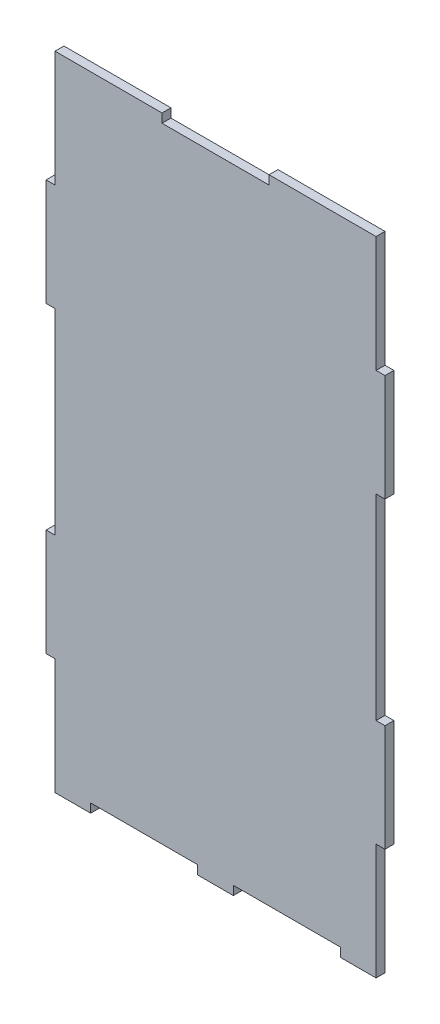
ISO-10303-21;
HEADER;
FILE_DESCRIPTION(('STEP AP214'),'2;1');
FILE_NAME('part.step','',(''),(''),'','','');
FILE_SCHEMA(('AUTOMOTIVE_DESIGN { 1 0 10303 214 1 1 1 1 }'));
ENDSEC;
DATA;
#1=APPLICATION_CONTEXT('core data for automotive mechanical design processes');
#2=APPLICATION_PROTOCOL_DEFINITION('international standard','automotive_design',2000,#1);
#3=PRODUCT_CONTEXT('',#1,'mechanical');
#4=PRODUCT('Part','Part','',(#3));
#5=PRODUCT_RELATED_PRODUCT_CATEGORY('part','',(#4));
#6=PRODUCT_DEFINITION_FORMATION('','',#4);
#7=PRODUCT_DEFINITION_CONTEXT('part definition',#1,'design');
#8=PRODUCT_DEFINITION('design','',#6,#7);
#9=PRODUCT_DEFINITION_SHAPE('','',#8);
#10=(LENGTH_UNIT() NAMED_UNIT(*) SI_UNIT(.MILLI.,.METRE.));
#11=(NAMED_UNIT(*) PLANE_ANGLE_UNIT() SI_UNIT($,.RADIAN.));
#12=(NAMED_UNIT(*) SI_UNIT($,.STERADIAN.) SOLID_ANGLE_UNIT());
#13=UNCERTAINTY_MEASURE_WITH_UNIT(LENGTH_MEASURE(1.E-05),#10,'distance_accuracy_value','');
#14=(GEOMETRIC_REPRESENTATION_CONTEXT(3) GLOBAL_UNCERTAINTY_ASSIGNED_CONTEXT((#13)) GLOBAL_UNIT_ASSIGNED_CONTEXT((#10,
#11,#12)) REPRESENTATION_CONTEXT('',''));
#15=CARTESIAN_POINT('',(0.,0.,0.));
#16=DIRECTION('',(0.,0.,1.));
#17=DIRECTION('',(1.,0.,0.));
#18=AXIS2_PLACEMENT_3D('',#15,#16,#17);
#19=CARTESIAN_POINT('',(-192.607659574468,-277.23829787234,6.35));
#20=DIRECTION('',(0.,1.,0.));
#21=DIRECTION('',(0.,0.,1.));
#22=AXIS2_PLACEMENT_3D('',#19,#20,#21);
#23=PLANE('',#22);
#24=DIRECTION('',(1.,0.,0.));
#25=VECTOR('',#24,1.);
#26=CARTESIAN_POINT('',(-192.607659574468,-277.23829787234,0.));
#27=LINE('',#26,#25);
#28=CARTESIAN_POINT('',(-91.0076595744681,-277.23829787234,0.));
#29=VERTEX_POINT('',#28);
#30=CARTESIAN_POINT('',(-65.6076595744681,-277.23829787234,0.));
#31=VERTEX_POINT('',#30);
#32=EDGE_CURVE('E268',#29,#31,#27,.T.);
#33=ORIENTED_EDGE('',*,*,#32,.T.);
#34=DIRECTION('',(0.,0.,1.));
#35=VECTOR('',#34,1.);
#36=CARTESIAN_POINT('',(-65.6076595744681,-277.23829787234,0.));
#37=LINE('',#36,#35);
#38=CARTESIAN_POINT('',(-65.6076595744681,-277.23829787234,6.35));
#39=VERTEX_POINT('',#38);
#40=EDGE_CURVE('E373',#31,#39,#37,.T.);
#41=ORIENTED_EDGE('',*,*,#40,.T.);
#42=DIRECTION('',(1.,0.,0.));
#43=VECTOR('',#42,1.);
#44=CARTESIAN_POINT('',(-192.607659574468,-277.23829787234,6.35));
#45=LINE('',#44,#43);
#46=CARTESIAN_POINT('',(-91.0076595744681,-277.23829787234,6.35));
#47=VERTEX_POINT('',#46);
#48=EDGE_CURVE('E323',#47,#39,#45,.T.);
#49=ORIENTED_EDGE('',*,*,#48,.F.);
#50=DIRECTION('',(0.,0.,1.));
#51=VECTOR('',#50,1.);
#52=CARTESIAN_POINT('',(-91.0076595744681,-277.23829787234,0.));
#53=LINE('',#52,#51);
#54=EDGE_CURVE('E381',#29,#47,#53,.T.);
#55=ORIENTED_EDGE('',*,*,#54,.F.);
#56=EDGE_LOOP('',(#33,#41,#49,#55));
#57=FACE_BOUND('',#56,.T.);
#58=ADVANCED_FACE('F35',(#57),#23,.F.);
#59=CARTESIAN_POINT('',(-192.607659574468,179.96170212766,6.35));
#60=DIRECTION('',(0.,-1.,0.));
#61=DIRECTION('',(0.,0.,-1.));
#62=AXIS2_PLACEMENT_3D('',#59,#60,#61);
#63=PLANE('',#62);
#64=DIRECTION('',(-1.,0.,0.));
#65=VECTOR('',#64,1.);
#66=CARTESIAN_POINT('',(-192.607659574468,179.96170212766,6.35));
#67=LINE('',#66,#65);
#68=CARTESIAN_POINT('',(-116.407659574468,179.96170212766,6.35));
#69=VERTEX_POINT('',#68);
#70=CARTESIAN_POINT('',(-192.607659574468,179.96170212766,6.35));
#71=VERTEX_POINT('',#70);
#72=EDGE_CURVE('E312',#69,#71,#67,.T.);
#73=ORIENTED_EDGE('',*,*,#72,.F.);
#74=DIRECTION('',(0.,0.,1.));
#75=VECTOR('',#74,1.);
#76=CARTESIAN_POINT('',(-116.407659574468,179.96170212766,0.));
#77=LINE('',#76,#75);
#78=CARTESIAN_POINT('',(-116.407659574468,179.96170212766,0.));
#79=VERTEX_POINT('',#78);
#80=EDGE_CURVE('E789',#79,#69,#77,.T.);
#81=ORIENTED_EDGE('',*,*,#80,.F.);
#82=DIRECTION('',(-1.,0.,0.));
#83=VECTOR('',#82,1.);
#84=CARTESIAN_POINT('',(-192.607659574468,179.96170212766,0.));
#85=LINE('',#84,#83);
#86=CARTESIAN_POINT('',(-192.607659574468,179.96170212766,0.));
#87=VERTEX_POINT('',#86);
#88=EDGE_CURVE('E289',#79,#87,#85,.T.);
#89=ORIENTED_EDGE('',*,*,#88,.T.);
#90=DIRECTION('',(0.,0.,-1.));
#91=VECTOR('',#90,1.);
#92=CARTESIAN_POINT('',(-192.607659574468,179.96170212766,6.35));
#93=LINE('',#92,#91);
#94=EDGE_CURVE('E301',#71,#87,#93,.T.);
#95=ORIENTED_EDGE('',*,*,#94,.F.);
#96=EDGE_LOOP('',(#73,#81,#89,#95));
#97=FACE_BOUND('',#96,.T.);
#98=ADVANCED_FACE('F518',(#97),#63,.F.);
#99=CARTESIAN_POINT('',(-192.607659574468,-277.23829787234,0.));
#100=VERTEX_POINT('',#99);
#101=CARTESIAN_POINT('',(-167.207659574468,-277.23829787234,0.));
#102=VERTEX_POINT('',#101);
#103=EDGE_CURVE('E271',#100,#102,#27,.T.);
#104=ORIENTED_EDGE('',*,*,#103,.T.);
#105=DIRECTION('',(0.,0.,1.));
#106=VECTOR('',#105,1.);
#107=CARTESIAN_POINT('',(-167.207659574468,-277.23829787234,0.));
#108=LINE('',#107,#106);
#109=CARTESIAN_POINT('',(-167.207659574468,-277.23829787234,6.35));
#110=VERTEX_POINT('',#109);
#111=EDGE_CURVE('E346',#102,#110,#108,.T.);
#112=ORIENTED_EDGE('',*,*,#111,.T.);
#113=CARTESIAN_POINT('',(-192.607659574468,-277.23829787234,6.35));
#114=VERTEX_POINT('',#113);
#115=EDGE_CURVE('E319',#114,#110,#45,.T.);
#116=ORIENTED_EDGE('',*,*,#115,.F.);
#117=DIRECTION('',(0.,0.,-1.));
#118=VECTOR('',#117,1.);
#119=CARTESIAN_POINT('',(-192.607659574468,-277.23829787234,6.35));
#120=LINE('',#119,#118);
#121=EDGE_CURVE('E11',#114,#100,#120,.T.);
#122=ORIENTED_EDGE('',*,*,#121,.T.);
#123=EDGE_LOOP('',(#104,#112,#116,#122));
#124=FACE_BOUND('',#123,.T.);
#125=ADVANCED_FACE('F345',(#124),#23,.F.);
#126=CARTESIAN_POINT('',(35.9923404255318,179.96170212766,6.35));
#127=DIRECTION('',(-1.,0.,0.));
#128=DIRECTION('',(0.,-1.,0.));
#129=AXIS2_PLACEMENT_3D('',#126,#127,#128);
#130=PLANE('',#129);
#131=DIRECTION('',(0.,1.,0.));
#132=VECTOR('',#131,1.);
#133=CARTESIAN_POINT('',(35.9923404255318,179.96170212766,0.));
#134=LINE('',#133,#132);
#135=CARTESIAN_POINT('',(35.9923404255319,-118.48829787234,0.));
#136=VERTEX_POINT('',#135);
#137=CARTESIAN_POINT('',(35.9923404255319,21.2117021276596,0.));
#138=VERTEX_POINT('',#137);
#139=EDGE_CURVE('E283',#136,#138,#134,.T.);
#140=ORIENTED_EDGE('',*,*,#139,.T.);
#141=DIRECTION('',(0.,0.,1.));
#142=VECTOR('',#141,1.);
#143=CARTESIAN_POINT('',(35.9923404255319,21.2117021276596,0.));
#144=LINE('',#143,#142);
#145=CARTESIAN_POINT('',(35.9923404255319,21.2117021276596,6.35));
#146=VERTEX_POINT('',#145);
#147=EDGE_CURVE('E404',#138,#146,#144,.T.);
#148=ORIENTED_EDGE('',*,*,#147,.T.);
#149=DIRECTION('',(0.,1.,0.));
#150=VECTOR('',#149,1.);
#151=CARTESIAN_POINT('',(35.9923404255318,179.96170212766,6.35));
#152=LINE('',#151,#150);
#153=CARTESIAN_POINT('',(35.9923404255319,-118.48829787234,6.35));
#154=VERTEX_POINT('',#153);
#155=EDGE_CURVE('E313',#154,#146,#152,.T.);
#156=ORIENTED_EDGE('',*,*,#155,.F.);
#157=DIRECTION('',(0.,0.,1.));
#158=VECTOR('',#157,1.);
#159=CARTESIAN_POINT('',(35.9923404255319,-118.48829787234,0.));
#160=LINE('',#159,#158);
#161=EDGE_CURVE('E430',#136,#154,#160,.T.);
#162=ORIENTED_EDGE('',*,*,#161,.F.);
#163=EDGE_LOOP('',(#140,#148,#156,#162));
#164=FACE_BOUND('',#163,.T.);
#165=ADVANCED_FACE('F527',(#164),#130,.F.);
#166=CARTESIAN_POINT('',(35.9923404255319,97.4117021276596,6.35));
#167=VERTEX_POINT('',#166);
#168=CARTESIAN_POINT('',(35.9923404255318,179.96170212766,6.35));
#169=VERTEX_POINT('',#168);
#170=EDGE_CURVE('E315',#167,#169,#152,.T.);
#171=ORIENTED_EDGE('',*,*,#170,.F.);
#172=DIRECTION('',(0.,0.,1.));
#173=VECTOR('',#172,1.);
#174=CARTESIAN_POINT('',(35.9923404255319,97.4117021276596,0.));
#175=LINE('',#174,#173);
#176=CARTESIAN_POINT('',(35.9923404255319,97.4117021276596,0.));
#177=VERTEX_POINT('',#176);
#178=EDGE_CURVE('E406',#177,#167,#175,.T.);
#179=ORIENTED_EDGE('',*,*,#178,.F.);
#180=CARTESIAN_POINT('',(35.9923404255318,179.96170212766,0.));
#181=VERTEX_POINT('',#180);
#182=EDGE_CURVE('E279',#177,#181,#134,.T.);
#183=ORIENTED_EDGE('',*,*,#182,.T.);
#184=DIRECTION('',(0.,0.,-1.));
#185=VECTOR('',#184,1.);
#186=CARTESIAN_POINT('',(35.9923404255318,179.96170212766,6.35));
#187=LINE('',#186,#185);
#188=EDGE_CURVE('E303',#169,#181,#187,.T.);
#189=ORIENTED_EDGE('',*,*,#188,.F.);
#190=EDGE_LOOP('',(#171,#179,#183,#189));
#191=FACE_BOUND('',#190,.T.);
#192=ADVANCED_FACE('F533',(#191),#130,.F.);
#193=CARTESIAN_POINT('',(-192.607659574468,179.96170212766,6.35));
#194=DIRECTION('',(1.,0.,0.));
#195=DIRECTION('',(0.,1.,0.));
#196=AXIS2_PLACEMENT_3D('',#193,#194,#195);
#197=PLANE('',#196);
#198=DIRECTION('',(0.,-1.,0.));
#199=VECTOR('',#198,1.);
#200=CARTESIAN_POINT('',(-192.607659574468,179.96170212766,0.));
#201=LINE('',#200,#199);
#202=CARTESIAN_POINT('',(-192.607659574468,21.2117021276595,0.));
#203=VERTEX_POINT('',#202);
#204=CARTESIAN_POINT('',(-192.607659574468,-118.48829787234,0.));
#205=VERTEX_POINT('',#204);
#206=EDGE_CURVE('E274',#203,#205,#201,.T.);
#207=ORIENTED_EDGE('',*,*,#206,.T.);
#208=DIRECTION('',(0.,0.,1.));
#209=VECTOR('',#208,1.);
#210=CARTESIAN_POINT('',(-192.607659574468,-118.48829787234,0.));
#211=LINE('',#210,#209);
#212=CARTESIAN_POINT('',(-192.607659574468,-118.48829787234,6.35));
#213=VERTEX_POINT('',#212);
#214=EDGE_CURVE('E450',#205,#213,#211,.T.);
#215=ORIENTED_EDGE('',*,*,#214,.T.);
#216=DIRECTION('',(0.,-1.,0.));
#217=VECTOR('',#216,1.);
#218=CARTESIAN_POINT('',(-192.607659574468,179.96170212766,6.35));
#219=LINE('',#218,#217);
#220=CARTESIAN_POINT('',(-192.607659574468,21.2117021276595,6.35));
#221=VERTEX_POINT('',#220);
#222=EDGE_CURVE('E330',#221,#213,#219,.T.);
#223=ORIENTED_EDGE('',*,*,#222,.F.);
#224=DIRECTION('',(0.,0.,1.));
#225=VECTOR('',#224,1.);
#226=CARTESIAN_POINT('',(-192.607659574468,21.2117021276595,0.));
#227=LINE('',#226,#225);
#228=EDGE_CURVE('E474',#203,#221,#227,.T.);
#229=ORIENTED_EDGE('',*,*,#228,.F.);
#230=EDGE_LOOP('',(#207,#215,#223,#229));
#231=FACE_BOUND('',#230,.T.);
#232=ADVANCED_FACE('F494',(#231),#197,.F.);
#233=CARTESIAN_POINT('',(-192.607659574468,-194.68829787234,6.35));
#234=VERTEX_POINT('',#233);
#235=EDGE_CURVE('E299',#234,#114,#219,.T.);
#236=ORIENTED_EDGE('',*,*,#235,.F.);
#237=DIRECTION('',(0.,0.,1.));
#238=VECTOR('',#237,1.);
#239=CARTESIAN_POINT('',(-192.607659574468,-194.68829787234,0.));
#240=LINE('',#239,#238);
#241=CARTESIAN_POINT('',(-192.607659574468,-194.68829787234,0.));
#242=VERTEX_POINT('',#241);
#243=EDGE_CURVE('E348',#242,#234,#240,.T.);
#244=ORIENTED_EDGE('',*,*,#243,.F.);
#245=EDGE_CURVE('E276',#242,#100,#201,.T.);
#246=ORIENTED_EDGE('',*,*,#245,.T.);
#247=ORIENTED_EDGE('',*,*,#121,.F.);
#248=EDGE_LOOP('',(#236,#244,#246,#247));
#249=FACE_BOUND('',#248,.T.);
#250=ADVANCED_FACE('F347',(#249),#197,.F.);
#251=CARTESIAN_POINT('',(-192.607659574468,97.4117021276596,0.));
#252=VERTEX_POINT('',#251);
#253=EDGE_CURVE('E269',#87,#252,#201,.T.);
#254=ORIENTED_EDGE('',*,*,#253,.T.);
#255=DIRECTION('',(0.,0.,1.));
#256=VECTOR('',#255,1.);
#257=CARTESIAN_POINT('',(-192.607659574468,97.4117021276596,0.));
#258=LINE('',#257,#256);
#259=CARTESIAN_POINT('',(-192.607659574468,97.4117021276596,6.35));
#260=VERTEX_POINT('',#259);
#261=EDGE_CURVE('E471',#252,#260,#258,.T.);
#262=ORIENTED_EDGE('',*,*,#261,.T.);
#263=EDGE_CURVE('E328',#71,#260,#219,.T.);
#264=ORIENTED_EDGE('',*,*,#263,.F.);
#265=ORIENTED_EDGE('',*,*,#94,.T.);
#266=EDGE_LOOP('',(#254,#262,#264,#265));
#267=FACE_BOUND('',#266,.T.);
#268=ADVANCED_FACE('F37',(#267),#197,.F.);
#269=CARTESIAN_POINT('',(10.5923404255319,-277.23829787234,6.35));
#270=VERTEX_POINT('',#269);
#271=CARTESIAN_POINT('',(35.9923404255319,-277.23829787234,6.35));
#272=VERTEX_POINT('',#271);
#273=EDGE_CURVE('E260',#270,#272,#45,.T.);
#274=ORIENTED_EDGE('',*,*,#273,.F.);
#275=DIRECTION('',(0.,0.,1.));
#276=VECTOR('',#275,1.);
#277=CARTESIAN_POINT('',(10.5923404255319,-277.23829787234,0.));
#278=LINE('',#277,#276);
#279=CARTESIAN_POINT('',(10.5923404255319,-277.23829787234,0.));
#280=VERTEX_POINT('',#279);
#281=EDGE_CURVE('E247',#280,#270,#278,.T.);
#282=ORIENTED_EDGE('',*,*,#281,.F.);
#283=CARTESIAN_POINT('',(35.9923404255319,-277.23829787234,0.));
#284=VERTEX_POINT('',#283);
#285=EDGE_CURVE('E258',#280,#284,#27,.T.);
#286=ORIENTED_EDGE('',*,*,#285,.T.);
#287=DIRECTION('',(0.,0.,-1.));
#288=VECTOR('',#287,1.);
#289=CARTESIAN_POINT('',(35.9923404255319,-277.23829787234,6.35));
#290=LINE('',#289,#288);
#291=EDGE_CURVE('E43',#272,#284,#290,.T.);
#292=ORIENTED_EDGE('',*,*,#291,.F.);
#293=EDGE_LOOP('',(#274,#282,#286,#292));
#294=FACE_BOUND('',#293,.T.);
#295=ADVANCED_FACE('F256',(#294),#23,.F.);
#296=CARTESIAN_POINT('',(35.9923404255319,-194.68829787234,0.));
#297=VERTEX_POINT('',#296);
#298=EDGE_CURVE('E267',#284,#297,#134,.T.);
#299=ORIENTED_EDGE('',*,*,#298,.T.);
#300=DIRECTION('',(0.,0.,1.));
#301=VECTOR('',#300,1.);
#302=CARTESIAN_POINT('',(35.9923404255319,-194.68829787234,0.));
#303=LINE('',#302,#301);
#304=CARTESIAN_POINT('',(35.9923404255319,-194.68829787234,6.35));
#305=VERTEX_POINT('',#304);
#306=EDGE_CURVE('E309',#297,#305,#303,.T.);
#307=ORIENTED_EDGE('',*,*,#306,.T.);
#308=EDGE_CURVE('E308',#272,#305,#152,.T.);
#309=ORIENTED_EDGE('',*,*,#308,.F.);
#310=ORIENTED_EDGE('',*,*,#291,.T.);
#311=EDGE_LOOP('',(#299,#307,#309,#310));
#312=FACE_BOUND('',#311,.T.);
#313=ADVANCED_FACE('F306',(#312),#130,.F.);
#314=CARTESIAN_POINT('',(-40.2076595744681,179.96170212766,0.));
#315=VERTEX_POINT('',#314);
#316=EDGE_CURVE('E292',#181,#315,#85,.T.);
#317=ORIENTED_EDGE('',*,*,#316,.T.);
#318=DIRECTION('',(0.,0.,1.));
#319=VECTOR('',#318,1.);
#320=CARTESIAN_POINT('',(-40.2076595744681,179.96170212766,0.));
#321=LINE('',#320,#319);
#322=CARTESIAN_POINT('',(-40.2076595744681,179.96170212766,6.35));
#323=VERTEX_POINT('',#322);
#324=EDGE_CURVE('E791',#315,#323,#321,.T.);
#325=ORIENTED_EDGE('',*,*,#324,.T.);
#326=EDGE_CURVE('E304',#169,#323,#67,.T.);
#327=ORIENTED_EDGE('',*,*,#326,.F.);
#328=ORIENTED_EDGE('',*,*,#188,.T.);
#329=EDGE_LOOP('',(#317,#325,#327,#328));
#330=FACE_BOUND('',#329,.T.);
#331=ADVANCED_FACE('F524',(#330),#63,.F.);
#332=CARTESIAN_POINT('',(0.,0.,6.35));
#333=DIRECTION('',(0.,0.,1.));
#334=DIRECTION('',(1.,0.,0.));
#335=AXIS2_PLACEMENT_3D('',#332,#333,#334);
#336=PLANE('',#335);
#337=DIRECTION('',(0.,-1.,0.));
#338=VECTOR('',#337,1.);
#339=CARTESIAN_POINT('',(-65.6076595744681,-277.23829787234,6.35));
#340=LINE('',#339,#338);
#341=CARTESIAN_POINT('',(-65.6076595744681,-270.88829787234,6.35));
#342=VERTEX_POINT('',#341);
#343=EDGE_CURVE('E252',#342,#39,#340,.T.);
#344=ORIENTED_EDGE('',*,*,#343,.F.);
#345=DIRECTION('',(-1.,0.,0.));
#346=VECTOR('',#345,1.);
#347=CARTESIAN_POINT('',(10.5923404255319,-270.88829787234,6.35));
#348=LINE('',#347,#346);
#349=CARTESIAN_POINT('',(10.5923404255319,-270.88829787234,6.35));
#350=VERTEX_POINT('',#349);
#351=EDGE_CURVE('E761',#350,#342,#348,.T.);
#352=ORIENTED_EDGE('',*,*,#351,.F.);
#353=DIRECTION('',(0.,1.,0.));
#354=VECTOR('',#353,1.);
#355=CARTESIAN_POINT('',(10.5923404255319,-277.23829787234,6.35));
#356=LINE('',#355,#354);
#357=EDGE_CURVE('E764',#270,#350,#356,.T.);
#358=ORIENTED_EDGE('',*,*,#357,.F.);
#359=ORIENTED_EDGE('',*,*,#273,.T.);
#360=ORIENTED_EDGE('',*,*,#308,.T.);
#361=DIRECTION('',(1.,0.,0.));
#362=VECTOR('',#361,1.);
#363=CARTESIAN_POINT('',(42.3423404255319,-194.68829787234,6.35));
#364=LINE('',#363,#362);
#365=CARTESIAN_POINT('',(42.3423404255319,-194.68829787234,6.35));
#366=VERTEX_POINT('',#365);
#367=EDGE_CURVE('E414',#305,#366,#364,.T.);
#368=ORIENTED_EDGE('',*,*,#367,.T.);
#369=DIRECTION('',(0.,1.,0.));
#370=VECTOR('',#369,1.);
#371=CARTESIAN_POINT('',(42.3423404255319,-118.48829787234,6.35));
#372=LINE('',#371,#370);
#373=CARTESIAN_POINT('',(42.3423404255319,-118.48829787234,6.35));
#374=VERTEX_POINT('',#373);
#375=EDGE_CURVE('E403',#366,#374,#372,.T.);
#376=ORIENTED_EDGE('',*,*,#375,.T.);
#377=DIRECTION('',(-1.,0.,0.));
#378=VECTOR('',#377,1.);
#379=CARTESIAN_POINT('',(42.3423404255319,-118.48829787234,6.35));
#380=LINE('',#379,#378);
#381=EDGE_CURVE('E422',#374,#154,#380,.T.);
#382=ORIENTED_EDGE('',*,*,#381,.T.);
#383=ORIENTED_EDGE('',*,*,#155,.T.);
#384=DIRECTION('',(1.,0.,0.));
#385=VECTOR('',#384,1.);
#386=CARTESIAN_POINT('',(42.3423404255319,21.2117021276596,6.35));
#387=LINE('',#386,#385);
#388=CARTESIAN_POINT('',(42.3423404255319,21.2117021276596,6.35));
#389=VERTEX_POINT('',#388);
#390=EDGE_CURVE('E388',#146,#389,#387,.T.);
#391=ORIENTED_EDGE('',*,*,#390,.T.);
#392=DIRECTION('',(0.,1.,0.));
#393=VECTOR('',#392,1.);
#394=CARTESIAN_POINT('',(42.3423404255319,97.4117021276596,6.35));
#395=LINE('',#394,#393);
#396=CARTESIAN_POINT('',(42.3423404255319,97.4117021276596,6.35));
#397=VERTEX_POINT('',#396);
#398=EDGE_CURVE('E378',#389,#397,#395,.T.);
#399=ORIENTED_EDGE('',*,*,#398,.T.);
#400=DIRECTION('',(-1.,0.,0.));
#401=VECTOR('',#400,1.);
#402=CARTESIAN_POINT('',(42.3423404255319,97.4117021276596,6.35));
#403=LINE('',#402,#401);
#404=EDGE_CURVE('E397',#397,#167,#403,.T.);
#405=ORIENTED_EDGE('',*,*,#404,.T.);
#406=ORIENTED_EDGE('',*,*,#170,.T.);
#407=ORIENTED_EDGE('',*,*,#326,.T.);
#408=DIRECTION('',(0.,1.,0.));
#409=VECTOR('',#408,1.);
#410=CARTESIAN_POINT('',(-40.2076595744681,179.96170212766,6.35));
#411=LINE('',#410,#409);
#412=CARTESIAN_POINT('',(-40.2076595744681,173.61170212766,6.35));
#413=VERTEX_POINT('',#412);
#414=EDGE_CURVE('E778',#413,#323,#411,.T.);
#415=ORIENTED_EDGE('',*,*,#414,.F.);
#416=DIRECTION('',(1.,0.,0.));
#417=VECTOR('',#416,1.);
#418=CARTESIAN_POINT('',(-116.407659574468,173.61170212766,6.35));
#419=LINE('',#418,#417);
#420=CARTESIAN_POINT('',(-116.407659574468,173.61170212766,6.35));
#421=VERTEX_POINT('',#420);
#422=EDGE_CURVE('E785',#421,#413,#419,.T.);
#423=ORIENTED_EDGE('',*,*,#422,.F.);
#424=DIRECTION('',(0.,-1.,0.));
#425=VECTOR('',#424,1.);
#426=CARTESIAN_POINT('',(-116.407659574468,179.96170212766,6.35));
#427=LINE('',#426,#425);
#428=EDGE_CURVE('E782',#69,#421,#427,.T.);
#429=ORIENTED_EDGE('',*,*,#428,.F.);
#430=ORIENTED_EDGE('',*,*,#72,.T.);
#431=ORIENTED_EDGE('',*,*,#263,.T.);
#432=DIRECTION('',(-1.,0.,0.));
#433=VECTOR('',#432,1.);
#434=CARTESIAN_POINT('',(-198.957659574468,97.4117021276596,6.35));
#435=LINE('',#434,#433);
#436=CARTESIAN_POINT('',(-198.957659574468,97.4117021276596,6.35));
#437=VERTEX_POINT('',#436);
#438=EDGE_CURVE('E458',#260,#437,#435,.T.);
#439=ORIENTED_EDGE('',*,*,#438,.T.);
#440=DIRECTION('',(0.,-1.,0.));
#441=VECTOR('',#440,1.);
#442=CARTESIAN_POINT('',(-198.957659574468,97.4117021276596,6.35));
#443=LINE('',#442,#441);
#444=CARTESIAN_POINT('',(-198.957659574468,21.2117021276595,6.35));
#445=VERTEX_POINT('',#444);
#446=EDGE_CURVE('E449',#437,#445,#443,.T.);
#447=ORIENTED_EDGE('',*,*,#446,.T.);
#448=DIRECTION('',(1.,0.,0.));
#449=VECTOR('',#448,1.);
#450=CARTESIAN_POINT('',(-198.957659574468,21.2117021276595,6.35));
#451=LINE('',#450,#449);
#452=EDGE_CURVE('E466',#445,#221,#451,.T.);
#453=ORIENTED_EDGE('',*,*,#452,.T.);
#454=ORIENTED_EDGE('',*,*,#222,.T.);
#455=DIRECTION('',(-1.,0.,0.));
#456=VECTOR('',#455,1.);
#457=CARTESIAN_POINT('',(-198.957659574468,-118.48829787234,6.35));
#458=LINE('',#457,#456);
#459=CARTESIAN_POINT('',(-198.957659574468,-118.48829787234,6.35));
#460=VERTEX_POINT('',#459);
#461=EDGE_CURVE('E437',#213,#460,#458,.T.);
#462=ORIENTED_EDGE('',*,*,#461,.T.);
#463=DIRECTION('',(0.,-1.,0.));
#464=VECTOR('',#463,1.);
#465=CARTESIAN_POINT('',(-198.957659574468,-118.48829787234,6.35));
#466=LINE('',#465,#464);
#467=CARTESIAN_POINT('',(-198.957659574468,-194.68829787234,6.35));
#468=VERTEX_POINT('',#467);
#469=EDGE_CURVE('E428',#460,#468,#466,.T.);
#470=ORIENTED_EDGE('',*,*,#469,.T.);
#471=DIRECTION('',(1.,0.,0.));
#472=VECTOR('',#471,1.);
#473=CARTESIAN_POINT('',(-198.957659574468,-194.68829787234,6.35));
#474=LINE('',#473,#472);
#475=EDGE_CURVE('E340',#468,#234,#474,.T.);
#476=ORIENTED_EDGE('',*,*,#475,.T.);
#477=ORIENTED_EDGE('',*,*,#235,.T.);
#478=ORIENTED_EDGE('',*,*,#115,.T.);
#479=DIRECTION('',(0.,-1.,0.));
#480=VECTOR('',#479,1.);
#481=CARTESIAN_POINT('',(-167.207659574468,-277.23829787234,6.35));
#482=LINE('',#481,#480);
#483=CARTESIAN_POINT('',(-167.207659574468,-270.88829787234,6.35));
#484=VERTEX_POINT('',#483);
#485=EDGE_CURVE('E371',#484,#110,#482,.T.);
#486=ORIENTED_EDGE('',*,*,#485,.F.);
#487=DIRECTION('',(-1.,0.,0.));
#488=VECTOR('',#487,1.);
#489=CARTESIAN_POINT('',(-167.207659574468,-270.88829787234,6.35));
#490=LINE('',#489,#488);
#491=CARTESIAN_POINT('',(-91.0076595744681,-270.88829787234,6.35));
#492=VERTEX_POINT('',#491);
#493=EDGE_CURVE('E360',#492,#484,#490,.T.);
#494=ORIENTED_EDGE('',*,*,#493,.F.);
#495=DIRECTION('',(0.,1.,0.));
#496=VECTOR('',#495,1.);
#497=CARTESIAN_POINT('',(-91.0076595744681,-277.23829787234,6.35));
#498=LINE('',#497,#496);
#499=EDGE_CURVE('E364',#47,#492,#498,.T.);
#500=ORIENTED_EDGE('',*,*,#499,.F.);
#501=ORIENTED_EDGE('',*,*,#48,.T.);
#502=EDGE_LOOP('',(#344,#352,#358,#359,#360,#368,#376,#382,#383,#391,#399,#405,#406,#407,#415,
#423,#429,#430,#431,#439,#447,#453,#454,#462,#470,#476,#477,#478,#486,#494,#500,#501));
#503=FACE_BOUND('',#502,.T.);
#504=ADVANCED_FACE('F337',(#503),#336,.T.);
#505=CARTESIAN_POINT('',(0.,0.,0.));
#506=DIRECTION('',(0.,0.,1.));
#507=DIRECTION('',(1.,0.,0.));
#508=AXIS2_PLACEMENT_3D('',#505,#506,#507);
#509=PLANE('',#508);
#510=DIRECTION('',(-1.,0.,0.));
#511=VECTOR('',#510,1.);
#512=CARTESIAN_POINT('',(10.5923404255319,-270.88829787234,0.));
#513=LINE('',#512,#511);
#514=CARTESIAN_POINT('',(10.5923404255319,-270.88829787234,0.));
#515=VERTEX_POINT('',#514);
#516=CARTESIAN_POINT('',(-65.6076595744681,-270.88829787234,0.));
#517=VERTEX_POINT('',#516);
#518=EDGE_CURVE('E50',#515,#517,#513,.T.);
#519=ORIENTED_EDGE('',*,*,#518,.T.);
#520=DIRECTION('',(0.,-1.,0.));
#521=VECTOR('',#520,1.);
#522=CARTESIAN_POINT('',(-65.6076595744681,-277.23829787234,0.));
#523=LINE('',#522,#521);
#524=EDGE_CURVE('E261',#517,#31,#523,.T.);
#525=ORIENTED_EDGE('',*,*,#524,.T.);
#526=ORIENTED_EDGE('',*,*,#32,.F.);
#527=DIRECTION('',(0.,1.,0.));
#528=VECTOR('',#527,1.);
#529=CARTESIAN_POINT('',(-91.0076595744681,-277.23829787234,0.));
#530=LINE('',#529,#528);
#531=CARTESIAN_POINT('',(-91.0076595744681,-270.88829787234,0.));
#532=VERTEX_POINT('',#531);
#533=EDGE_CURVE('E359',#29,#532,#530,.T.);
#534=ORIENTED_EDGE('',*,*,#533,.T.);
#535=DIRECTION('',(-1.,0.,0.));
#536=VECTOR('',#535,1.);
#537=CARTESIAN_POINT('',(-167.207659574468,-270.88829787234,0.));
#538=LINE('',#537,#536);
#539=CARTESIAN_POINT('',(-167.207659574468,-270.88829787234,0.));
#540=VERTEX_POINT('',#539);
#541=EDGE_CURVE('E357',#532,#540,#538,.T.);
#542=ORIENTED_EDGE('',*,*,#541,.T.);
#543=DIRECTION('',(0.,-1.,0.));
#544=VECTOR('',#543,1.);
#545=CARTESIAN_POINT('',(-167.207659574468,-277.23829787234,0.));
#546=LINE('',#545,#544);
#547=EDGE_CURVE('E355',#540,#102,#546,.T.);
#548=ORIENTED_EDGE('',*,*,#547,.T.);
#549=ORIENTED_EDGE('',*,*,#103,.F.);
#550=ORIENTED_EDGE('',*,*,#245,.F.);
#551=DIRECTION('',(1.,0.,0.));
#552=VECTOR('',#551,1.);
#553=CARTESIAN_POINT('',(-198.957659574468,-194.68829787234,0.));
#554=LINE('',#553,#552);
#555=CARTESIAN_POINT('',(-198.957659574468,-194.68829787234,0.));
#556=VERTEX_POINT('',#555);
#557=EDGE_CURVE('E436',#556,#242,#554,.T.);
#558=ORIENTED_EDGE('',*,*,#557,.F.);
#559=DIRECTION('',(0.,-1.,0.));
#560=VECTOR('',#559,1.);
#561=CARTESIAN_POINT('',(-198.957659574468,-118.48829787234,0.));
#562=LINE('',#561,#560);
#563=CARTESIAN_POINT('',(-198.957659574468,-118.48829787234,0.));
#564=VERTEX_POINT('',#563);
#565=EDGE_CURVE('E433',#564,#556,#562,.T.);
#566=ORIENTED_EDGE('',*,*,#565,.F.);
#567=DIRECTION('',(-1.,0.,0.));
#568=VECTOR('',#567,1.);
#569=CARTESIAN_POINT('',(-198.957659574468,-118.48829787234,0.));
#570=LINE('',#569,#568);
#571=EDGE_CURVE('E439',#205,#564,#570,.T.);
#572=ORIENTED_EDGE('',*,*,#571,.F.);
#573=ORIENTED_EDGE('',*,*,#206,.F.);
#574=DIRECTION('',(1.,0.,0.));
#575=VECTOR('',#574,1.);
#576=CARTESIAN_POINT('',(-198.957659574468,21.2117021276595,0.));
#577=LINE('',#576,#575);
#578=CARTESIAN_POINT('',(-198.957659574468,21.2117021276595,0.));
#579=VERTEX_POINT('',#578);
#580=EDGE_CURVE('E457',#579,#203,#577,.T.);
#581=ORIENTED_EDGE('',*,*,#580,.F.);
#582=DIRECTION('',(0.,-1.,0.));
#583=VECTOR('',#582,1.);
#584=CARTESIAN_POINT('',(-198.957659574468,97.4117021276596,0.));
#585=LINE('',#584,#583);
#586=CARTESIAN_POINT('',(-198.957659574468,97.4117021276596,0.));
#587=VERTEX_POINT('',#586);
#588=EDGE_CURVE('E454',#587,#579,#585,.T.);
#589=ORIENTED_EDGE('',*,*,#588,.F.);
#590=DIRECTION('',(-1.,0.,0.));
#591=VECTOR('',#590,1.);
#592=CARTESIAN_POINT('',(-198.957659574468,97.4117021276596,0.));
#593=LINE('',#592,#591);
#594=EDGE_CURVE('E460',#252,#587,#593,.T.);
#595=ORIENTED_EDGE('',*,*,#594,.F.);
#596=ORIENTED_EDGE('',*,*,#253,.F.);
#597=ORIENTED_EDGE('',*,*,#88,.F.);
#598=DIRECTION('',(0.,-1.,0.));
#599=VECTOR('',#598,1.);
#600=CARTESIAN_POINT('',(-116.407659574468,179.96170212766,0.));
#601=LINE('',#600,#599);
#602=CARTESIAN_POINT('',(-116.407659574468,173.61170212766,0.));
#603=VERTEX_POINT('',#602);
#604=EDGE_CURVE('E775',#79,#603,#601,.T.);
#605=ORIENTED_EDGE('',*,*,#604,.T.);
#606=DIRECTION('',(1.,0.,0.));
#607=VECTOR('',#606,1.);
#608=CARTESIAN_POINT('',(-116.407659574468,173.61170212766,0.));
#609=LINE('',#608,#607);
#610=CARTESIAN_POINT('',(-40.2076595744681,173.61170212766,0.));
#611=VERTEX_POINT('',#610);
#612=EDGE_CURVE('E777',#603,#611,#609,.T.);
#613=ORIENTED_EDGE('',*,*,#612,.T.);
#614=DIRECTION('',(0.,1.,0.));
#615=VECTOR('',#614,1.);
#616=CARTESIAN_POINT('',(-40.2076595744681,179.96170212766,0.));
#617=LINE('',#616,#615);
#618=EDGE_CURVE('E58',#611,#315,#617,.T.);
#619=ORIENTED_EDGE('',*,*,#618,.T.);
#620=ORIENTED_EDGE('',*,*,#316,.F.);
#621=ORIENTED_EDGE('',*,*,#182,.F.);
#622=DIRECTION('',(-1.,0.,0.));
#623=VECTOR('',#622,1.);
#624=CARTESIAN_POINT('',(42.3423404255319,97.4117021276596,0.));
#625=LINE('',#624,#623);
#626=CARTESIAN_POINT('',(42.3423404255319,97.4117021276596,0.));
#627=VERTEX_POINT('',#626);
#628=EDGE_CURVE('E387',#627,#177,#625,.T.);
#629=ORIENTED_EDGE('',*,*,#628,.F.);
#630=DIRECTION('',(0.,1.,0.));
#631=VECTOR('',#630,1.);
#632=CARTESIAN_POINT('',(42.3423404255319,97.4117021276596,0.));
#633=LINE('',#632,#631);
#634=CARTESIAN_POINT('',(42.3423404255319,21.2117021276596,0.));
#635=VERTEX_POINT('',#634);
#636=EDGE_CURVE('E384',#635,#627,#633,.T.);
#637=ORIENTED_EDGE('',*,*,#636,.F.);
#638=DIRECTION('',(1.,0.,0.));
#639=VECTOR('',#638,1.);
#640=CARTESIAN_POINT('',(42.3423404255319,21.2117021276596,0.));
#641=LINE('',#640,#639);
#642=EDGE_CURVE('E391',#138,#635,#641,.T.);
#643=ORIENTED_EDGE('',*,*,#642,.F.);
#644=ORIENTED_EDGE('',*,*,#139,.F.);
#645=DIRECTION('',(-1.,0.,0.));
#646=VECTOR('',#645,1.);
#647=CARTESIAN_POINT('',(42.3423404255319,-118.48829787234,0.));
#648=LINE('',#647,#646);
#649=CARTESIAN_POINT('',(42.3423404255319,-118.48829787234,0.));
#650=VERTEX_POINT('',#649);
#651=EDGE_CURVE('E413',#650,#136,#648,.T.);
#652=ORIENTED_EDGE('',*,*,#651,.F.);
#653=DIRECTION('',(0.,1.,0.));
#654=VECTOR('',#653,1.);
#655=CARTESIAN_POINT('',(42.3423404255319,-118.48829787234,0.));
#656=LINE('',#655,#654);
#657=CARTESIAN_POINT('',(42.3423404255319,-194.68829787234,0.));
#658=VERTEX_POINT('',#657);
#659=EDGE_CURVE('E410',#658,#650,#656,.T.);
#660=ORIENTED_EDGE('',*,*,#659,.F.);
#661=DIRECTION('',(1.,0.,0.));
#662=VECTOR('',#661,1.);
#663=CARTESIAN_POINT('',(42.3423404255319,-194.68829787234,0.));
#664=LINE('',#663,#662);
#665=EDGE_CURVE('E416',#297,#658,#664,.T.);
#666=ORIENTED_EDGE('',*,*,#665,.F.);
#667=ORIENTED_EDGE('',*,*,#298,.F.);
#668=ORIENTED_EDGE('',*,*,#285,.F.);
#669=DIRECTION('',(0.,1.,0.));
#670=VECTOR('',#669,1.);
#671=CARTESIAN_POINT('',(10.5923404255319,-277.23829787234,0.));
#672=LINE('',#671,#670);
#673=EDGE_CURVE('E243',#280,#515,#672,.T.);
#674=ORIENTED_EDGE('',*,*,#673,.T.);
#675=EDGE_LOOP('',(#519,#525,#526,#534,#542,#548,#549,#550,#558,#566,#572,#573,#581,#589,#595,
#596,#597,#605,#613,#619,#620,#621,#629,#637,#643,#644,#652,#660,#666,#667,#668,#674));
#676=FACE_BOUND('',#675,.T.);
#677=ADVANCED_FACE('F264',(#676),#509,.F.);
#678=CARTESIAN_POINT('',(-198.957659574468,97.4117021276596,0.));
#679=DIRECTION('',(-1.,0.,0.));
#680=DIRECTION('',(0.,0.,1.));
#681=AXIS2_PLACEMENT_3D('',#678,#679,#680);
#682=PLANE('',#681);
#683=ORIENTED_EDGE('',*,*,#446,.F.);
#684=DIRECTION('',(0.,0.,1.));
#685=VECTOR('',#684,1.);
#686=CARTESIAN_POINT('',(-198.957659574468,97.4117021276596,0.));
#687=LINE('',#686,#685);
#688=EDGE_CURVE('E351',#587,#437,#687,.T.);
#689=ORIENTED_EDGE('',*,*,#688,.F.);
#690=ORIENTED_EDGE('',*,*,#588,.T.);
#691=DIRECTION('',(0.,0.,1.));
#692=VECTOR('',#691,1.);
#693=CARTESIAN_POINT('',(-198.957659574468,21.2117021276595,0.));
#694=LINE('',#693,#692);
#695=EDGE_CURVE('E463',#579,#445,#694,.T.);
#696=ORIENTED_EDGE('',*,*,#695,.T.);
#697=EDGE_LOOP('',(#683,#689,#690,#696));
#698=FACE_BOUND('',#697,.T.);
#699=ADVANCED_FACE('F478',(#698),#682,.T.);
#700=CARTESIAN_POINT('',(-198.957659574468,97.4117021276596,0.));
#701=DIRECTION('',(0.,1.,0.));
#702=DIRECTION('',(0.,0.,1.));
#703=AXIS2_PLACEMENT_3D('',#700,#701,#702);
#704=PLANE('',#703);
#705=ORIENTED_EDGE('',*,*,#438,.F.);
#706=ORIENTED_EDGE('',*,*,#261,.F.);
#707=ORIENTED_EDGE('',*,*,#594,.T.);
#708=ORIENTED_EDGE('',*,*,#688,.T.);
#709=EDGE_LOOP('',(#705,#706,#707,#708));
#710=FACE_BOUND('',#709,.T.);
#711=ADVANCED_FACE('F486',(#710),#704,.T.);
#712=CARTESIAN_POINT('',(-198.957659574468,21.2117021276595,0.));
#713=DIRECTION('',(0.,-1.,0.));
#714=DIRECTION('',(0.,0.,-1.));
#715=AXIS2_PLACEMENT_3D('',#712,#713,#714);
#716=PLANE('',#715);
#717=ORIENTED_EDGE('',*,*,#452,.F.);
#718=ORIENTED_EDGE('',*,*,#695,.F.);
#719=ORIENTED_EDGE('',*,*,#580,.T.);
#720=ORIENTED_EDGE('',*,*,#228,.T.);
#721=EDGE_LOOP('',(#717,#718,#719,#720));
#722=FACE_BOUND('',#721,.T.);
#723=ADVANCED_FACE('F482',(#722),#716,.T.);
#724=CARTESIAN_POINT('',(-198.957659574468,-118.48829787234,0.));
#725=DIRECTION('',(-1.,0.,0.));
#726=DIRECTION('',(0.,0.,1.));
#727=AXIS2_PLACEMENT_3D('',#724,#725,#726);
#728=PLANE('',#727);
#729=ORIENTED_EDGE('',*,*,#469,.F.);
#730=DIRECTION('',(0.,0.,1.));
#731=VECTOR('',#730,1.);
#732=CARTESIAN_POINT('',(-198.957659574468,-118.48829787234,0.));
#733=LINE('',#732,#731);
#734=EDGE_CURVE('E447',#564,#460,#733,.T.);
#735=ORIENTED_EDGE('',*,*,#734,.F.);
#736=ORIENTED_EDGE('',*,*,#565,.T.);
#737=DIRECTION('',(0.,0.,1.));
#738=VECTOR('',#737,1.);
#739=CARTESIAN_POINT('',(-198.957659574468,-194.68829787234,0.));
#740=LINE('',#739,#738);
#741=EDGE_CURVE('E442',#556,#468,#740,.T.);
#742=ORIENTED_EDGE('',*,*,#741,.T.);
#743=EDGE_LOOP('',(#729,#735,#736,#742));
#744=FACE_BOUND('',#743,.T.);
#745=ADVANCED_FACE('F502',(#744),#728,.T.);
#746=CARTESIAN_POINT('',(-198.957659574468,-118.48829787234,0.));
#747=DIRECTION('',(0.,1.,0.));
#748=DIRECTION('',(-1.,0.,0.));
#749=AXIS2_PLACEMENT_3D('',#746,#747,#748);
#750=PLANE('',#749);
#751=ORIENTED_EDGE('',*,*,#461,.F.);
#752=ORIENTED_EDGE('',*,*,#214,.F.);
#753=ORIENTED_EDGE('',*,*,#571,.T.);
#754=ORIENTED_EDGE('',*,*,#734,.T.);
#755=EDGE_LOOP('',(#751,#752,#753,#754));
#756=FACE_BOUND('',#755,.T.);
#757=ADVANCED_FACE('F498',(#756),#750,.T.);
#758=CARTESIAN_POINT('',(-198.957659574468,-194.68829787234,0.));
#759=DIRECTION('',(0.,-1.,0.));
#760=DIRECTION('',(0.,0.,-1.));
#761=AXIS2_PLACEMENT_3D('',#758,#759,#760);
#762=PLANE('',#761);
#763=ORIENTED_EDGE('',*,*,#475,.F.);
#764=ORIENTED_EDGE('',*,*,#741,.F.);
#765=ORIENTED_EDGE('',*,*,#557,.T.);
#766=ORIENTED_EDGE('',*,*,#243,.T.);
#767=EDGE_LOOP('',(#763,#764,#765,#766));
#768=FACE_BOUND('',#767,.T.);
#769=ADVANCED_FACE('F504',(#768),#762,.T.);
#770=CARTESIAN_POINT('',(42.3423404255319,-118.48829787234,0.));
#771=DIRECTION('',(1.,0.,0.));
#772=DIRECTION('',(0.,0.,-1.));
#773=AXIS2_PLACEMENT_3D('',#770,#771,#772);
#774=PLANE('',#773);
#775=ORIENTED_EDGE('',*,*,#375,.F.);
#776=DIRECTION('',(0.,0.,1.));
#777=VECTOR('',#776,1.);
#778=CARTESIAN_POINT('',(42.3423404255319,-194.68829787234,0.));
#779=LINE('',#778,#777);
#780=EDGE_CURVE('E426',#658,#366,#779,.T.);
#781=ORIENTED_EDGE('',*,*,#780,.F.);
#782=ORIENTED_EDGE('',*,*,#659,.T.);
#783=DIRECTION('',(0.,0.,1.));
#784=VECTOR('',#783,1.);
#785=CARTESIAN_POINT('',(42.3423404255319,-118.48829787234,0.));
#786=LINE('',#785,#784);
#787=EDGE_CURVE('E419',#650,#374,#786,.T.);
#788=ORIENTED_EDGE('',*,*,#787,.T.);
#789=EDGE_LOOP('',(#775,#781,#782,#788));
#790=FACE_BOUND('',#789,.T.);
#791=ADVANCED_FACE('F506',(#790),#774,.T.);
#792=CARTESIAN_POINT('',(42.3423404255319,-194.68829787234,0.));
#793=DIRECTION('',(0.,-1.,0.));
#794=DIRECTION('',(0.,0.,-1.));
#795=AXIS2_PLACEMENT_3D('',#792,#793,#794);
#796=PLANE('',#795);
#797=ORIENTED_EDGE('',*,*,#367,.F.);
#798=ORIENTED_EDGE('',*,*,#306,.F.);
#799=ORIENTED_EDGE('',*,*,#665,.T.);
#800=ORIENTED_EDGE('',*,*,#780,.T.);
#801=EDGE_LOOP('',(#797,#798,#799,#800));
#802=FACE_BOUND('',#801,.T.);
#803=ADVANCED_FACE('F512',(#802),#796,.T.);
#804=CARTESIAN_POINT('',(42.3423404255319,-118.48829787234,0.));
#805=DIRECTION('',(0.,1.,0.));
#806=DIRECTION('',(-1.,0.,0.));
#807=AXIS2_PLACEMENT_3D('',#804,#805,#806);
#808=PLANE('',#807);
#809=ORIENTED_EDGE('',*,*,#381,.F.);
#810=ORIENTED_EDGE('',*,*,#787,.F.);
#811=ORIENTED_EDGE('',*,*,#651,.T.);
#812=ORIENTED_EDGE('',*,*,#161,.T.);
#813=EDGE_LOOP('',(#809,#810,#811,#812));
#814=FACE_BOUND('',#813,.T.);
#815=ADVANCED_FACE('F585',(#814),#808,.T.);
#816=CARTESIAN_POINT('',(42.3423404255319,97.4117021276596,0.));
#817=DIRECTION('',(1.,0.,0.));
#818=DIRECTION('',(0.,0.,-1.));
#819=AXIS2_PLACEMENT_3D('',#816,#817,#818);
#820=PLANE('',#819);
#821=ORIENTED_EDGE('',*,*,#398,.F.);
#822=DIRECTION('',(0.,0.,1.));
#823=VECTOR('',#822,1.);
#824=CARTESIAN_POINT('',(42.3423404255319,21.2117021276596,0.));
#825=LINE('',#824,#823);
#826=EDGE_CURVE('E401',#635,#389,#825,.T.);
#827=ORIENTED_EDGE('',*,*,#826,.F.);
#828=ORIENTED_EDGE('',*,*,#636,.T.);
#829=DIRECTION('',(0.,0.,1.));
#830=VECTOR('',#829,1.);
#831=CARTESIAN_POINT('',(42.3423404255319,97.4117021276596,0.));
#832=LINE('',#831,#830);
#833=EDGE_CURVE('E394',#627,#397,#832,.T.);
#834=ORIENTED_EDGE('',*,*,#833,.T.);
#835=EDGE_LOOP('',(#821,#827,#828,#834));
#836=FACE_BOUND('',#835,.T.);
#837=ADVANCED_FACE('F595',(#836),#820,.T.);
#838=CARTESIAN_POINT('',(42.3423404255319,21.2117021276596,0.));
#839=DIRECTION('',(0.,-1.,0.));
#840=DIRECTION('',(1.,0.,0.));
#841=AXIS2_PLACEMENT_3D('',#838,#839,#840);
#842=PLANE('',#841);
#843=ORIENTED_EDGE('',*,*,#390,.F.);
#844=ORIENTED_EDGE('',*,*,#147,.F.);
#845=ORIENTED_EDGE('',*,*,#642,.T.);
#846=ORIENTED_EDGE('',*,*,#826,.T.);
#847=EDGE_LOOP('',(#843,#844,#845,#846));
#848=FACE_BOUND('',#847,.T.);
#849=ADVANCED_FACE('F605',(#848),#842,.T.);
#850=CARTESIAN_POINT('',(42.3423404255319,97.4117021276596,0.));
#851=DIRECTION('',(0.,1.,0.));
#852=DIRECTION('',(0.,0.,1.));
#853=AXIS2_PLACEMENT_3D('',#850,#851,#852);
#854=PLANE('',#853);
#855=ORIENTED_EDGE('',*,*,#404,.F.);
#856=ORIENTED_EDGE('',*,*,#833,.F.);
#857=ORIENTED_EDGE('',*,*,#628,.T.);
#858=ORIENTED_EDGE('',*,*,#178,.T.);
#859=EDGE_LOOP('',(#855,#856,#857,#858));
#860=FACE_BOUND('',#859,.T.);
#861=ADVANCED_FACE('F615',(#860),#854,.T.);
#862=CARTESIAN_POINT('',(-167.207659574468,-277.23829787234,0.));
#863=DIRECTION('',(-1.,0.,0.));
#864=DIRECTION('',(0.,0.,1.));
#865=AXIS2_PLACEMENT_3D('',#862,#863,#864);
#866=PLANE('',#865);
#867=ORIENTED_EDGE('',*,*,#485,.T.);
#868=ORIENTED_EDGE('',*,*,#111,.F.);
#869=ORIENTED_EDGE('',*,*,#547,.F.);
#870=DIRECTION('',(0.,0.,1.));
#871=VECTOR('',#870,1.);
#872=CARTESIAN_POINT('',(-167.207659574468,-270.88829787234,0.));
#873=LINE('',#872,#871);
#874=EDGE_CURVE('E376',#540,#484,#873,.T.);
#875=ORIENTED_EDGE('',*,*,#874,.T.);
#876=EDGE_LOOP('',(#867,#868,#869,#875));
#877=FACE_BOUND('',#876,.T.);
#878=ADVANCED_FACE('F624',(#877),#866,.F.);
#879=CARTESIAN_POINT('',(-167.207659574468,-270.88829787234,0.));
#880=DIRECTION('',(0.,1.,0.));
#881=DIRECTION('',(0.,0.,1.));
#882=AXIS2_PLACEMENT_3D('',#879,#880,#881);
#883=PLANE('',#882);
#884=ORIENTED_EDGE('',*,*,#493,.T.);
#885=ORIENTED_EDGE('',*,*,#874,.F.);
#886=ORIENTED_EDGE('',*,*,#541,.F.);
#887=DIRECTION('',(0.,0.,1.));
#888=VECTOR('',#887,1.);
#889=CARTESIAN_POINT('',(-91.0076595744681,-270.88829787234,0.));
#890=LINE('',#889,#888);
#891=EDGE_CURVE('E379',#532,#492,#890,.T.);
#892=ORIENTED_EDGE('',*,*,#891,.T.);
#893=EDGE_LOOP('',(#884,#885,#886,#892));
#894=FACE_BOUND('',#893,.T.);
#895=ADVANCED_FACE('F680',(#894),#883,.F.);
#896=CARTESIAN_POINT('',(-91.0076595744681,-277.23829787234,0.));
#897=DIRECTION('',(1.,0.,0.));
#898=DIRECTION('',(0.,0.,-1.));
#899=AXIS2_PLACEMENT_3D('',#896,#897,#898);
#900=PLANE('',#899);
#901=ORIENTED_EDGE('',*,*,#499,.T.);
#902=ORIENTED_EDGE('',*,*,#891,.F.);
#903=ORIENTED_EDGE('',*,*,#533,.F.);
#904=ORIENTED_EDGE('',*,*,#54,.T.);
#905=EDGE_LOOP('',(#901,#902,#903,#904));
#906=FACE_BOUND('',#905,.T.);
#907=ADVANCED_FACE('F689',(#906),#900,.F.);
#908=CARTESIAN_POINT('',(-116.407659574468,179.96170212766,0.));
#909=DIRECTION('',(-1.,0.,0.));
#910=DIRECTION('',(0.,0.,1.));
#911=AXIS2_PLACEMENT_3D('',#908,#909,#910);
#912=PLANE('',#911);
#913=ORIENTED_EDGE('',*,*,#428,.T.);
#914=DIRECTION('',(0.,0.,1.));
#915=VECTOR('',#914,1.);
#916=CARTESIAN_POINT('',(-116.407659574468,173.61170212766,0.));
#917=LINE('',#916,#915);
#918=EDGE_CURVE('E367',#603,#421,#917,.T.);
#919=ORIENTED_EDGE('',*,*,#918,.F.);
#920=ORIENTED_EDGE('',*,*,#604,.F.);
#921=ORIENTED_EDGE('',*,*,#80,.T.);
#922=EDGE_LOOP('',(#913,#919,#920,#921));
#923=FACE_BOUND('',#922,.T.);
#924=ADVANCED_FACE('F699',(#923),#912,.F.);
#925=CARTESIAN_POINT('',(-40.2076595744681,179.96170212766,0.));
#926=DIRECTION('',(1.,0.,0.));
#927=DIRECTION('',(0.,0.,-1.));
#928=AXIS2_PLACEMENT_3D('',#925,#926,#927);
#929=PLANE('',#928);
#930=ORIENTED_EDGE('',*,*,#414,.T.);
#931=ORIENTED_EDGE('',*,*,#324,.F.);
#932=ORIENTED_EDGE('',*,*,#618,.F.);
#933=DIRECTION('',(0.,0.,1.));
#934=VECTOR('',#933,1.);
#935=CARTESIAN_POINT('',(-40.2076595744681,173.61170212766,0.));
#936=LINE('',#935,#934);
#937=EDGE_CURVE('E793',#611,#413,#936,.T.);
#938=ORIENTED_EDGE('',*,*,#937,.T.);
#939=EDGE_LOOP('',(#930,#931,#932,#938));
#940=FACE_BOUND('',#939,.T.);
#941=ADVANCED_FACE('F709',(#940),#929,.F.);
#942=CARTESIAN_POINT('',(-116.407659574468,173.61170212766,0.));
#943=DIRECTION('',(0.,-1.,0.));
#944=DIRECTION('',(0.,0.,-1.));
#945=AXIS2_PLACEMENT_3D('',#942,#943,#944);
#946=PLANE('',#945);
#947=ORIENTED_EDGE('',*,*,#422,.T.);
#948=ORIENTED_EDGE('',*,*,#937,.F.);
#949=ORIENTED_EDGE('',*,*,#612,.F.);
#950=ORIENTED_EDGE('',*,*,#918,.T.);
#951=EDGE_LOOP('',(#947,#948,#949,#950));
#952=FACE_BOUND('',#951,.T.);
#953=ADVANCED_FACE('F719',(#952),#946,.F.);
#954=CARTESIAN_POINT('',(-65.6076595744681,-277.23829787234,0.));
#955=DIRECTION('',(-1.,0.,0.));
#956=DIRECTION('',(0.,0.,1.));
#957=AXIS2_PLACEMENT_3D('',#954,#955,#956);
#958=PLANE('',#957);
#959=ORIENTED_EDGE('',*,*,#343,.T.);
#960=ORIENTED_EDGE('',*,*,#40,.F.);
#961=ORIENTED_EDGE('',*,*,#524,.F.);
#962=DIRECTION('',(0.,0.,1.));
#963=VECTOR('',#962,1.);
#964=CARTESIAN_POINT('',(-65.6076595744681,-270.88829787234,0.));
#965=LINE('',#964,#963);
#966=EDGE_CURVE('E762',#517,#342,#965,.T.);
#967=ORIENTED_EDGE('',*,*,#966,.T.);
#968=EDGE_LOOP('',(#959,#960,#961,#967));
#969=FACE_BOUND('',#968,.T.);
#970=ADVANCED_FACE('F728',(#969),#958,.F.);
#971=CARTESIAN_POINT('',(10.5923404255319,-270.88829787234,0.));
#972=DIRECTION('',(0.,1.,0.));
#973=DIRECTION('',(0.,0.,1.));
#974=AXIS2_PLACEMENT_3D('',#971,#972,#973);
#975=PLANE('',#974);
#976=ORIENTED_EDGE('',*,*,#351,.T.);
#977=ORIENTED_EDGE('',*,*,#966,.F.);
#978=ORIENTED_EDGE('',*,*,#518,.F.);
#979=DIRECTION('',(0.,0.,1.));
#980=VECTOR('',#979,1.);
#981=CARTESIAN_POINT('',(10.5923404255319,-270.88829787234,0.));
#982=LINE('',#981,#980);
#983=EDGE_CURVE('E249',#515,#350,#982,.T.);
#984=ORIENTED_EDGE('',*,*,#983,.T.);
#985=EDGE_LOOP('',(#976,#977,#978,#984));
#986=FACE_BOUND('',#985,.T.);
#987=ADVANCED_FACE('F738',(#986),#975,.F.);
#988=CARTESIAN_POINT('',(10.5923404255319,-277.23829787234,0.));
#989=DIRECTION('',(1.,0.,0.));
#990=DIRECTION('',(0.,0.,-1.));
#991=AXIS2_PLACEMENT_3D('',#988,#989,#990);
#992=PLANE('',#991);
#993=ORIENTED_EDGE('',*,*,#357,.T.);
#994=ORIENTED_EDGE('',*,*,#983,.F.);
#995=ORIENTED_EDGE('',*,*,#673,.F.);
#996=ORIENTED_EDGE('',*,*,#281,.T.);
#997=EDGE_LOOP('',(#993,#994,#995,#996));
#998=FACE_BOUND('',#997,.T.);
#999=ADVANCED_FACE('F246',(#998),#992,.F.);
#1000=CLOSED_SHELL('',(#58,#98,#125,#165,#192,#232,#250,#268,#295,#313,#331,#504,#677,#699,#711,
#723,#745,#757,#769,#791,#803,#815,#837,#849,#861,#878,#895,#907,#924,#941,#953,#970,#987,#999));
#1001=MANIFOLD_SOLID_BREP('B2',#1000);
#1002=ADVANCED_BREP_SHAPE_REPRESENTATION('',(#18,#1001),#14);
#1003=SHAPE_DEFINITION_REPRESENTATION(#9,#1002);
ENDSEC;
END-ISO-10303-21;
